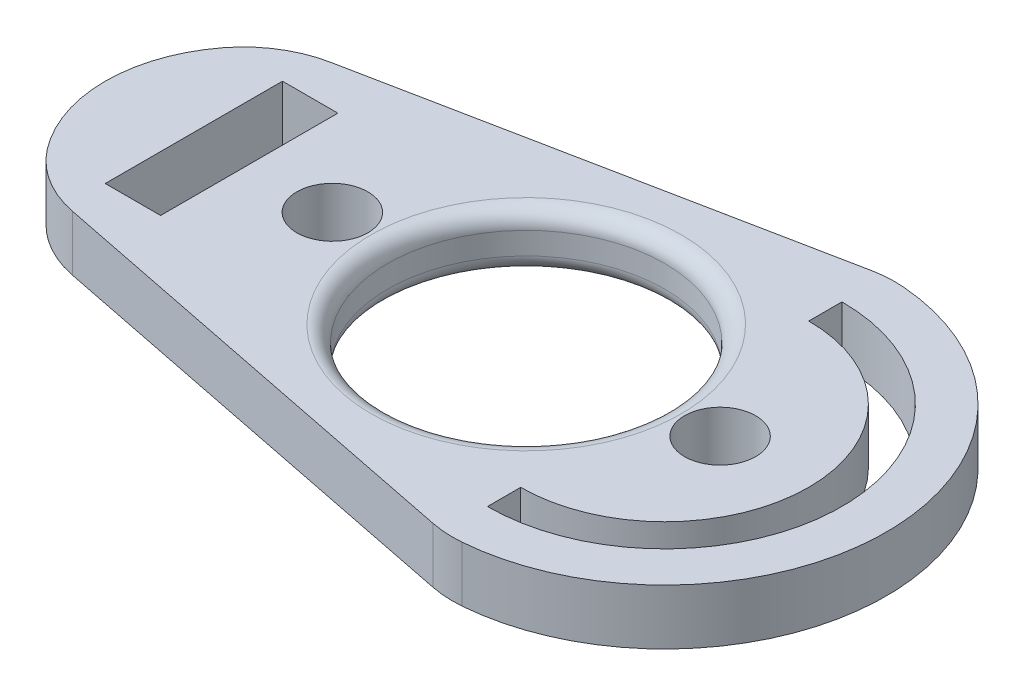
ISO-10303-21;
HEADER;
FILE_DESCRIPTION(('STEP AP214'),'2;1');
FILE_NAME('part.step','',(''),(''),'','','');
FILE_SCHEMA(('AUTOMOTIVE_DESIGN { 1 0 10303 214 1 1 1 1 }'));
ENDSEC;
DATA;
#1=APPLICATION_CONTEXT('core data for automotive mechanical design processes');
#2=APPLICATION_PROTOCOL_DEFINITION('international standard','automotive_design',2000,#1);
#3=PRODUCT_CONTEXT('',#1,'mechanical');
#4=PRODUCT('Part','Part','',(#3));
#5=PRODUCT_RELATED_PRODUCT_CATEGORY('part','',(#4));
#6=PRODUCT_DEFINITION_FORMATION('','',#4);
#7=PRODUCT_DEFINITION_CONTEXT('part definition',#1,'design');
#8=PRODUCT_DEFINITION('design','',#6,#7);
#9=PRODUCT_DEFINITION_SHAPE('','',#8);
#10=(LENGTH_UNIT() NAMED_UNIT(*) SI_UNIT(.MILLI.,.METRE.));
#11=(NAMED_UNIT(*) PLANE_ANGLE_UNIT() SI_UNIT($,.RADIAN.));
#12=(NAMED_UNIT(*) SI_UNIT($,.STERADIAN.) SOLID_ANGLE_UNIT());
#13=UNCERTAINTY_MEASURE_WITH_UNIT(LENGTH_MEASURE(1.E-05),#10,'distance_accuracy_value','');
#14=(GEOMETRIC_REPRESENTATION_CONTEXT(3) GLOBAL_UNCERTAINTY_ASSIGNED_CONTEXT((#13)) GLOBAL_UNIT_ASSIGNED_CONTEXT((#10,
#11,#12)) REPRESENTATION_CONTEXT('',''));
#15=CARTESIAN_POINT('',(0.,0.,0.));
#16=DIRECTION('',(0.,0.,1.));
#17=DIRECTION('',(1.,0.,0.));
#18=AXIS2_PLACEMENT_3D('',#15,#16,#17);
#19=CARTESIAN_POINT('',(0.,0.5,-0.8));
#20=DIRECTION('',(0.,0.,-1.));
#21=DIRECTION('',(-1.,0.,0.));
#22=AXIS2_PLACEMENT_3D('',#19,#20,#21);
#23=PLANE('',#22);
#24=DIRECTION('',(1.,0.,0.));
#25=VECTOR('',#24,1.);
#26=CARTESIAN_POINT('',(0.,0.,-0.8));
#27=LINE('',#26,#25);
#28=CARTESIAN_POINT('',(-4.25,0.,-0.8));
#29=VERTEX_POINT('',#28);
#30=CARTESIAN_POINT('',(-3.75,0.,-0.8));
#31=VERTEX_POINT('',#30);
#32=EDGE_CURVE('E223',#29,#31,#27,.T.);
#33=ORIENTED_EDGE('',*,*,#32,.T.);
#34=DIRECTION('',(0.,-1.,0.));
#35=VECTOR('',#34,1.);
#36=CARTESIAN_POINT('',(-3.75,0.5,-0.8));
#37=LINE('',#36,#35);
#38=CARTESIAN_POINT('',(-3.75,0.5,-0.8));
#39=VERTEX_POINT('',#38);
#40=EDGE_CURVE('E174',#39,#31,#37,.T.);
#41=ORIENTED_EDGE('',*,*,#40,.F.);
#42=DIRECTION('',(1.,0.,0.));
#43=VECTOR('',#42,1.);
#44=CARTESIAN_POINT('',(0.,0.5,-0.8));
#45=LINE('',#44,#43);
#46=CARTESIAN_POINT('',(-4.25,0.5,-0.8));
#47=VERTEX_POINT('',#46);
#48=EDGE_CURVE('E163',#47,#39,#45,.T.);
#49=ORIENTED_EDGE('',*,*,#48,.F.);
#50=DIRECTION('',(0.,-1.,0.));
#51=VECTOR('',#50,1.);
#52=CARTESIAN_POINT('',(-4.25,0.5,-0.8));
#53=LINE('',#52,#51);
#54=EDGE_CURVE('E54',#47,#29,#53,.T.);
#55=ORIENTED_EDGE('',*,*,#54,.T.);
#56=EDGE_LOOP('',(#33,#41,#49,#55));
#57=FACE_BOUND('',#56,.T.);
#58=ADVANCED_FACE('F37',(#57),#23,.F.);
#59=CARTESIAN_POINT('',(-3.75,0.5,0.));
#60=DIRECTION('',(1.,0.,0.));
#61=DIRECTION('',(0.,0.,-1.));
#62=AXIS2_PLACEMENT_3D('',#59,#60,#61);
#63=PLANE('',#62);
#64=DIRECTION('',(0.,0.,1.));
#65=VECTOR('',#64,1.);
#66=CARTESIAN_POINT('',(-3.75,0.,0.));
#67=LINE('',#66,#65);
#68=CARTESIAN_POINT('',(-3.75,0.,0.8));
#69=VERTEX_POINT('',#68);
#70=EDGE_CURVE('E171',#31,#69,#67,.T.);
#71=ORIENTED_EDGE('',*,*,#70,.T.);
#72=DIRECTION('',(0.,-1.,0.));
#73=VECTOR('',#72,1.);
#74=CARTESIAN_POINT('',(-3.75,0.5,0.8));
#75=LINE('',#74,#73);
#76=CARTESIAN_POINT('',(-3.75,0.5,0.8));
#77=VERTEX_POINT('',#76);
#78=EDGE_CURVE('E169',#77,#69,#75,.T.);
#79=ORIENTED_EDGE('',*,*,#78,.F.);
#80=DIRECTION('',(0.,0.,1.));
#81=VECTOR('',#80,1.);
#82=CARTESIAN_POINT('',(-3.75,0.5,0.));
#83=LINE('',#82,#81);
#84=EDGE_CURVE('E157',#39,#77,#83,.T.);
#85=ORIENTED_EDGE('',*,*,#84,.F.);
#86=ORIENTED_EDGE('',*,*,#40,.T.);
#87=EDGE_LOOP('',(#71,#79,#85,#86));
#88=FACE_BOUND('',#87,.T.);
#89=ADVANCED_FACE('F170',(#88),#63,.F.);
#90=CARTESIAN_POINT('',(0.,0.5,0.8));
#91=DIRECTION('',(0.,0.,-1.));
#92=DIRECTION('',(-1.,0.,0.));
#93=AXIS2_PLACEMENT_3D('',#90,#91,#92);
#94=PLANE('',#93);
#95=DIRECTION('',(1.,0.,0.));
#96=VECTOR('',#95,1.);
#97=CARTESIAN_POINT('',(0.,0.,0.8));
#98=LINE('',#97,#96);
#99=CARTESIAN_POINT('',(-4.25,0.,0.8));
#100=VERTEX_POINT('',#99);
#101=EDGE_CURVE('E226',#100,#69,#98,.T.);
#102=ORIENTED_EDGE('',*,*,#101,.F.);
#103=DIRECTION('',(0.,-1.,0.));
#104=VECTOR('',#103,1.);
#105=CARTESIAN_POINT('',(-4.25,0.5,0.8));
#106=LINE('',#105,#104);
#107=CARTESIAN_POINT('',(-4.25,0.5,0.8));
#108=VERTEX_POINT('',#107);
#109=EDGE_CURVE('E104',#108,#100,#106,.T.);
#110=ORIENTED_EDGE('',*,*,#109,.F.);
#111=DIRECTION('',(1.,0.,0.));
#112=VECTOR('',#111,1.);
#113=CARTESIAN_POINT('',(0.,0.5,0.8));
#114=LINE('',#113,#112);
#115=EDGE_CURVE('E162',#108,#77,#114,.T.);
#116=ORIENTED_EDGE('',*,*,#115,.T.);
#117=ORIENTED_EDGE('',*,*,#78,.T.);
#118=EDGE_LOOP('',(#102,#110,#116,#117));
#119=FACE_BOUND('',#118,.T.);
#120=ADVANCED_FACE('F176',(#119),#94,.T.);
#121=CARTESIAN_POINT('',(-1.05819487287301E-11,0.5,-1.28546370596616E-10));
#122=DIRECTION('',(0.,-1.,0.));
#123=DIRECTION('',(0.,0.,-1.));
#124=AXIS2_PLACEMENT_3D('',#121,#122,#123);
#125=CYLINDRICAL_SURFACE('',#124,1.3);
#126=CARTESIAN_POINT('',(-1.05819487287301E-11,0.,-1.28546370596616E-10));
#127=DIRECTION('',(0.,1.,0.));
#128=DIRECTION('',(0.,0.,1.));
#129=AXIS2_PLACEMENT_3D('',#126,#127,#128);
#130=CIRCLE('',#129,1.3);
#131=CARTESIAN_POINT('',(-1.0582065822565E-11,0.,-1.30000000012855));
#132=VERTEX_POINT('',#131);
#133=CARTESIAN_POINT('',(-1.0582065822565E-11,0.,1.29999999987145));
#134=VERTEX_POINT('',#133);
#135=EDGE_CURVE('E205',#132,#134,#130,.F.);
#136=ORIENTED_EDGE('',*,*,#135,.F.);
#137=DIRECTION('',(0.,-1.,0.));
#138=VECTOR('',#137,1.);
#139=CARTESIAN_POINT('',(-1.0582065822565E-11,0.5,-1.30000000012855));
#140=LINE('',#139,#138);
#141=CARTESIAN_POINT('',(-1.0582065822565E-11,0.5,-1.30000000012855));
#142=VERTEX_POINT('',#141);
#143=EDGE_CURVE('E233',#142,#132,#140,.T.);
#144=ORIENTED_EDGE('',*,*,#143,.F.);
#145=CARTESIAN_POINT('',(-1.05819487287301E-11,0.5,-1.28546370596616E-10));
#146=DIRECTION('',(0.,1.,0.));
#147=DIRECTION('',(0.,0.,1.));
#148=AXIS2_PLACEMENT_3D('',#145,#146,#147);
#149=CIRCLE('',#148,1.3);
#150=CARTESIAN_POINT('',(-1.0582065822565E-11,0.5,1.29999999987145));
#151=VERTEX_POINT('',#150);
#152=EDGE_CURVE('E399',#142,#151,#149,.F.);
#153=ORIENTED_EDGE('',*,*,#152,.T.);
#154=DIRECTION('',(0.,-1.,0.));
#155=VECTOR('',#154,1.);
#156=CARTESIAN_POINT('',(-1.0582065822565E-11,0.5,1.29999999987145));
#157=LINE('',#156,#155);
#158=EDGE_CURVE('E237',#151,#134,#157,.T.);
#159=ORIENTED_EDGE('',*,*,#158,.T.);
#160=EDGE_LOOP('',(#136,#144,#153,#159));
#161=FACE_BOUND('',#160,.T.);
#162=ADVANCED_FACE('F333',(#161),#125,.T.);
#163=CARTESIAN_POINT('',(-1.05825008262379E-11,0.5,0.));
#164=DIRECTION('',(1.,0.,0.));
#165=DIRECTION('',(0.,0.,-1.));
#166=AXIS2_PLACEMENT_3D('',#163,#164,#165);
#167=PLANE('',#166);
#168=DIRECTION('',(0.,0.,1.));
#169=VECTOR('',#168,1.);
#170=CARTESIAN_POINT('',(-1.05825008262379E-11,0.,0.));
#171=LINE('',#170,#169);
#172=CARTESIAN_POINT('',(-1.05819654371021E-11,0.,-1.60000000012855));
#173=VERTEX_POINT('',#172);
#174=EDGE_CURVE('E208',#173,#132,#171,.T.);
#175=ORIENTED_EDGE('',*,*,#174,.F.);
#176=DIRECTION('',(0.,-1.,0.));
#177=VECTOR('',#176,1.);
#178=CARTESIAN_POINT('',(-1.05819654371021E-11,0.5,-1.60000000012855));
#179=LINE('',#178,#177);
#180=CARTESIAN_POINT('',(-1.05819654371021E-11,0.5,-1.60000000012855));
#181=VERTEX_POINT('',#180);
#182=EDGE_CURVE('E242',#181,#173,#179,.T.);
#183=ORIENTED_EDGE('',*,*,#182,.F.);
#184=DIRECTION('',(0.,0.,1.));
#185=VECTOR('',#184,1.);
#186=CARTESIAN_POINT('',(-1.05825008262379E-11,0.5,0.));
#187=LINE('',#186,#185);
#188=EDGE_CURVE('E402',#181,#142,#187,.T.);
#189=ORIENTED_EDGE('',*,*,#188,.T.);
#190=ORIENTED_EDGE('',*,*,#143,.T.);
#191=EDGE_LOOP('',(#175,#183,#189,#190));
#192=FACE_BOUND('',#191,.T.);
#193=ADVANCED_FACE('F329',(#192),#167,.T.);
#194=CARTESIAN_POINT('',(-1.05819487287301E-11,0.5,-1.28546370596616E-10));
#195=DIRECTION('',(0.,-1.,0.));
#196=DIRECTION('',(0.,0.,-1.));
#197=AXIS2_PLACEMENT_3D('',#194,#195,#196);
#198=CYLINDRICAL_SURFACE('',#197,1.6);
#199=CARTESIAN_POINT('',(-1.05819487287301E-11,0.,-1.28546370596616E-10));
#200=DIRECTION('',(0.,1.,0.));
#201=DIRECTION('',(0.,0.,1.));
#202=AXIS2_PLACEMENT_3D('',#199,#200,#201);
#203=CIRCLE('',#202,1.6);
#204=CARTESIAN_POINT('',(-1.05819654371021E-11,0.,1.59999999987145));
#205=VERTEX_POINT('',#204);
#206=EDGE_CURVE('E211',#173,#205,#203,.F.);
#207=ORIENTED_EDGE('',*,*,#206,.T.);
#208=DIRECTION('',(0.,-1.,0.));
#209=VECTOR('',#208,1.);
#210=CARTESIAN_POINT('',(-1.05819654371021E-11,0.5,1.59999999987145));
#211=LINE('',#210,#209);
#212=CARTESIAN_POINT('',(-1.05819654371021E-11,0.5,1.59999999987145));
#213=VERTEX_POINT('',#212);
#214=EDGE_CURVE('E239',#213,#205,#211,.T.);
#215=ORIENTED_EDGE('',*,*,#214,.F.);
#216=CARTESIAN_POINT('',(-1.05819487287301E-11,0.5,-1.28546370596616E-10));
#217=DIRECTION('',(0.,1.,0.));
#218=DIRECTION('',(0.,0.,1.));
#219=AXIS2_PLACEMENT_3D('',#216,#217,#218);
#220=CIRCLE('',#219,1.6);
#221=EDGE_CURVE('E405',#181,#213,#220,.F.);
#222=ORIENTED_EDGE('',*,*,#221,.F.);
#223=ORIENTED_EDGE('',*,*,#182,.T.);
#224=EDGE_LOOP('',(#207,#215,#222,#223));
#225=FACE_BOUND('',#224,.T.);
#226=ADVANCED_FACE('F325',(#225),#198,.F.);
#227=CARTESIAN_POINT('',(-0.384272849561752,0.5,-1.92321957143991));
#228=DIRECTION('',(0.195934209060197,0.,0.980617043355843));
#229=DIRECTION('',(0.980617043355843,0.,-0.195934209060197));
#230=AXIS2_PLACEMENT_3D('',#227,#228,#229);
#231=PLANE('',#230);
#232=DIRECTION('',(-0.980617043355843,0.,0.195934209060197));
#233=VECTOR('',#232,1.);
#234=CARTESIAN_POINT('',(-0.384272849561752,0.,-1.92321957143991));
#235=LINE('',#234,#233);
#236=CARTESIAN_POINT('',(-0.113883759060197,0.,-1.97724522084595));
#237=VERTEX_POINT('',#236);
#238=CARTESIAN_POINT('',(-4.183235690524,0.,-1.16415997265328));
#239=VERTEX_POINT('',#238);
#240=EDGE_CURVE('E183',#237,#239,#235,.T.);
#241=ORIENTED_EDGE('',*,*,#240,.T.);
#242=DIRECTION('',(0.,-1.,0.));
#243=VECTOR('',#242,1.);
#244=CARTESIAN_POINT('',(-4.183235690524,0.5,-1.16415997265328));
#245=LINE('',#244,#243);
#246=CARTESIAN_POINT('',(-4.183235690524,0.5,-1.16415997265328));
#247=VERTEX_POINT('',#246);
#248=EDGE_CURVE('E240',#247,#239,#245,.T.);
#249=ORIENTED_EDGE('',*,*,#248,.F.);
#250=DIRECTION('',(-0.980617043355843,0.,0.195934209060197));
#251=VECTOR('',#250,1.);
#252=CARTESIAN_POINT('',(-0.384272849561752,0.5,-1.92321957143991));
#253=LINE('',#252,#251);
#254=CARTESIAN_POINT('',(-0.113883759060197,0.5,-1.97724522084595));
#255=VERTEX_POINT('',#254);
#256=EDGE_CURVE('E231',#255,#247,#253,.T.);
#257=ORIENTED_EDGE('',*,*,#256,.F.);
#258=DIRECTION('',(0.,-1.,0.));
#259=VECTOR('',#258,1.);
#260=CARTESIAN_POINT('',(-0.113883759060197,0.5,-1.97724522084595));
#261=LINE('',#260,#259);
#262=EDGE_CURVE('E179',#255,#237,#261,.T.);
#263=ORIENTED_EDGE('',*,*,#262,.T.);
#264=EDGE_LOOP('',(#241,#249,#257,#263));
#265=FACE_BOUND('',#264,.T.);
#266=ADVANCED_FACE('F328',(#265),#231,.F.);
#267=CARTESIAN_POINT('',(-3.9873014814638,0.5,-0.183542929297438));
#268=DIRECTION('',(0.,-1.,0.));
#269=DIRECTION('',(0.,0.,-1.));
#270=AXIS2_PLACEMENT_3D('',#267,#268,#269);
#271=CYLINDRICAL_SURFACE('',#270,1.);
#272=CARTESIAN_POINT('',(-3.9873014814638,0.,-0.183542929297438));
#273=DIRECTION('',(0.,1.,0.));
#274=DIRECTION('',(0.,0.,1.));
#275=AXIS2_PLACEMENT_3D('',#272,#273,#274);
#276=CIRCLE('',#275,1.);
#277=CARTESIAN_POINT('',(-4.77830641967648,0.,-0.795352693622231));
#278=VERTEX_POINT('',#277);
#279=EDGE_CURVE('E186',#239,#278,#276,.T.);
#280=ORIENTED_EDGE('',*,*,#279,.T.);
#281=DIRECTION('',(0.,-1.,0.));
#282=VECTOR('',#281,1.);
#283=CARTESIAN_POINT('',(-4.77830641967648,0.5,-0.795352693622231));
#284=LINE('',#283,#282);
#285=CARTESIAN_POINT('',(-4.77830641967648,0.5,-0.795352693622231));
#286=VERTEX_POINT('',#285);
#287=EDGE_CURVE('E257',#286,#278,#284,.T.);
#288=ORIENTED_EDGE('',*,*,#287,.F.);
#289=CARTESIAN_POINT('',(-3.9873014814638,0.5,-0.183542929297438));
#290=DIRECTION('',(0.,1.,0.));
#291=DIRECTION('',(0.,0.,1.));
#292=AXIS2_PLACEMENT_3D('',#289,#290,#291);
#293=CIRCLE('',#292,1.);
#294=EDGE_CURVE('E117',#247,#286,#293,.T.);
#295=ORIENTED_EDGE('',*,*,#294,.F.);
#296=ORIENTED_EDGE('',*,*,#248,.T.);
#297=EDGE_LOOP('',(#280,#288,#295,#296));
#298=FACE_BOUND('',#297,.T.);
#299=ADVANCED_FACE('F356',(#298),#271,.T.);
#300=CARTESIAN_POINT('',(-3.75,0.5,0.));
#301=DIRECTION('',(0.,-1.,0.));
#302=DIRECTION('',(0.,0.,-1.));
#303=AXIS2_PLACEMENT_3D('',#300,#301,#302);
#304=CYLINDRICAL_SURFACE('',#303,1.3);
#305=CARTESIAN_POINT('',(-3.75,0.,0.));
#306=DIRECTION('',(0.,1.,0.));
#307=DIRECTION('',(0.,0.,1.));
#308=AXIS2_PLACEMENT_3D('',#305,#306,#307);
#309=CIRCLE('',#308,1.3);
#310=CARTESIAN_POINT('',(-4.77830641967648,0.,0.795352693622231));
#311=VERTEX_POINT('',#310);
#312=EDGE_CURVE('E188',#278,#311,#309,.T.);
#313=ORIENTED_EDGE('',*,*,#312,.T.);
#314=DIRECTION('',(0.,-1.,0.));
#315=VECTOR('',#314,1.);
#316=CARTESIAN_POINT('',(-4.77830641967648,0.5,0.795352693622231));
#317=LINE('',#316,#315);
#318=CARTESIAN_POINT('',(-4.77830641967648,0.5,0.795352693622231));
#319=VERTEX_POINT('',#318);
#320=EDGE_CURVE('E255',#319,#311,#317,.T.);
#321=ORIENTED_EDGE('',*,*,#320,.F.);
#322=CARTESIAN_POINT('',(-3.75,0.5,0.));
#323=DIRECTION('',(0.,1.,0.));
#324=DIRECTION('',(0.,0.,1.));
#325=AXIS2_PLACEMENT_3D('',#322,#323,#324);
#326=CIRCLE('',#325,1.3);
#327=EDGE_CURVE('E386',#286,#319,#326,.T.);
#328=ORIENTED_EDGE('',*,*,#327,.F.);
#329=ORIENTED_EDGE('',*,*,#287,.T.);
#330=EDGE_LOOP('',(#313,#321,#328,#329));
#331=FACE_BOUND('',#330,.T.);
#332=ADVANCED_FACE('F352',(#331),#304,.T.);
#333=CARTESIAN_POINT('',(-3.9873014814638,0.5,0.183542929297438));
#334=DIRECTION('',(0.,-1.,0.));
#335=DIRECTION('',(0.,0.,-1.));
#336=AXIS2_PLACEMENT_3D('',#333,#334,#335);
#337=CYLINDRICAL_SURFACE('',#336,1.);
#338=CARTESIAN_POINT('',(-3.9873014814638,0.,0.183542929297438));
#339=DIRECTION('',(0.,1.,0.));
#340=DIRECTION('',(0.,0.,1.));
#341=AXIS2_PLACEMENT_3D('',#338,#339,#340);
#342=CIRCLE('',#341,1.);
#343=CARTESIAN_POINT('',(-4.183235690524,0.,1.16415997265328));
#344=VERTEX_POINT('',#343);
#345=EDGE_CURVE('E191',#344,#311,#342,.F.);
#346=ORIENTED_EDGE('',*,*,#345,.F.);
#347=DIRECTION('',(0.,-1.,0.));
#348=VECTOR('',#347,1.);
#349=CARTESIAN_POINT('',(-4.183235690524,0.5,1.16415997265328));
#350=LINE('',#349,#348);
#351=CARTESIAN_POINT('',(-4.183235690524,0.5,1.16415997265328));
#352=VERTEX_POINT('',#351);
#353=EDGE_CURVE('E253',#352,#344,#350,.T.);
#354=ORIENTED_EDGE('',*,*,#353,.F.);
#355=CARTESIAN_POINT('',(-3.9873014814638,0.5,0.183542929297438));
#356=DIRECTION('',(0.,1.,0.));
#357=DIRECTION('',(0.,0.,1.));
#358=AXIS2_PLACEMENT_3D('',#355,#356,#357);
#359=CIRCLE('',#358,1.);
#360=EDGE_CURVE('E388',#352,#319,#359,.F.);
#361=ORIENTED_EDGE('',*,*,#360,.T.);
#362=ORIENTED_EDGE('',*,*,#320,.T.);
#363=EDGE_LOOP('',(#346,#354,#361,#362));
#364=FACE_BOUND('',#363,.T.);
#365=ADVANCED_FACE('F348',(#364),#337,.T.);
#366=CARTESIAN_POINT('',(-0.384272849561752,0.5,1.92321957143991));
#367=DIRECTION('',(-0.195934209060197,0.,0.980617043355843));
#368=DIRECTION('',(0.980617043355843,0.,0.195934209060197));
#369=AXIS2_PLACEMENT_3D('',#366,#367,#368);
#370=PLANE('',#369);
#371=DIRECTION('',(-0.980617043355843,0.,-0.195934209060197));
#372=VECTOR('',#371,1.);
#373=CARTESIAN_POINT('',(-0.384272849561752,0.,1.92321957143991));
#374=LINE('',#373,#372);
#375=CARTESIAN_POINT('',(-0.113883759971435,0.,1.97724522066388));
#376=VERTEX_POINT('',#375);
#377=EDGE_CURVE('E194',#376,#344,#374,.T.);
#378=ORIENTED_EDGE('',*,*,#377,.F.);
#379=DIRECTION('',(0.,-1.,0.));
#380=VECTOR('',#379,1.);
#381=CARTESIAN_POINT('',(-0.113883759971435,0.5,1.97724522066388));
#382=LINE('',#381,#380);
#383=CARTESIAN_POINT('',(-0.113883759971435,0.5,1.97724522066388));
#384=VERTEX_POINT('',#383);
#385=EDGE_CURVE('E251',#384,#376,#382,.T.);
#386=ORIENTED_EDGE('',*,*,#385,.F.);
#387=DIRECTION('',(-0.980617043355843,0.,-0.195934209060197));
#388=VECTOR('',#387,1.);
#389=CARTESIAN_POINT('',(-0.384272849561752,0.5,1.92321957143991));
#390=LINE('',#389,#388);
#391=EDGE_CURVE('E380',#384,#352,#390,.T.);
#392=ORIENTED_EDGE('',*,*,#391,.T.);
#393=ORIENTED_EDGE('',*,*,#353,.T.);
#394=EDGE_LOOP('',(#378,#386,#392,#393));
#395=FACE_BOUND('',#394,.T.);
#396=ADVANCED_FACE('F344',(#395),#370,.T.);
#397=CARTESIAN_POINT('',(0.0820504490887623,0.5,0.996628177308034));
#398=DIRECTION('',(0.,-1.,0.));
#399=DIRECTION('',(0.,0.,-1.));
#400=AXIS2_PLACEMENT_3D('',#397,#398,#399);
#401=CYLINDRICAL_SURFACE('',#400,1.);
#402=CARTESIAN_POINT('',(0.0820504490887623,0.,0.996628177308034));
#403=DIRECTION('',(0.,1.,0.));
#404=DIRECTION('',(0.,0.,1.));
#405=AXIS2_PLACEMENT_3D('',#402,#403,#404);
#406=CIRCLE('',#405,1.);
#407=CARTESIAN_POINT('',(0.164100898177525,0.,1.99325635461607));
#408=VERTEX_POINT('',#407);
#409=EDGE_CURVE('E197',#376,#408,#406,.T.);
#410=ORIENTED_EDGE('',*,*,#409,.T.);
#411=DIRECTION('',(0.,-1.,0.));
#412=VECTOR('',#411,1.);
#413=CARTESIAN_POINT('',(0.164100898177525,0.5,1.99325635461607));
#414=LINE('',#413,#412);
#415=CARTESIAN_POINT('',(0.164100898177525,0.5,1.99325635461607));
#416=VERTEX_POINT('',#415);
#417=EDGE_CURVE('E249',#416,#408,#414,.T.);
#418=ORIENTED_EDGE('',*,*,#417,.F.);
#419=CARTESIAN_POINT('',(0.0820504490887623,0.5,0.996628177308034));
#420=DIRECTION('',(0.,1.,0.));
#421=DIRECTION('',(0.,0.,1.));
#422=AXIS2_PLACEMENT_3D('',#419,#420,#421);
#423=CIRCLE('',#422,1.);
#424=EDGE_CURVE('E395',#384,#416,#423,.T.);
#425=ORIENTED_EDGE('',*,*,#424,.F.);
#426=ORIENTED_EDGE('',*,*,#385,.T.);
#427=EDGE_LOOP('',(#410,#418,#425,#426));
#428=FACE_BOUND('',#427,.T.);
#429=ADVANCED_FACE('F340',(#428),#401,.T.);
#430=CARTESIAN_POINT('',(-1.05819487287301E-11,0.5,-1.28546370596616E-10));
#431=DIRECTION('',(0.,-1.,0.));
#432=DIRECTION('',(0.,0.,-1.));
#433=AXIS2_PLACEMENT_3D('',#430,#431,#432);
#434=CYLINDRICAL_SURFACE('',#433,2.00000000012898);
#435=CARTESIAN_POINT('',(-1.05819487287301E-11,0.,-1.28546370596616E-10));
#436=DIRECTION('',(0.,1.,0.));
#437=DIRECTION('',(0.,0.,1.));
#438=AXIS2_PLACEMENT_3D('',#435,#436,#437);
#439=CIRCLE('',#438,2.00000000012898);
#440=CARTESIAN_POINT('',(0.164100899999999,0.,-1.99325635472312));
#441=VERTEX_POINT('',#440);
#442=EDGE_CURVE('E200',#441,#408,#439,.F.);
#443=ORIENTED_EDGE('',*,*,#442,.F.);
#444=DIRECTION('',(0.,-1.,0.));
#445=VECTOR('',#444,1.);
#446=CARTESIAN_POINT('',(0.164100899999999,0.5,-1.99325635472312));
#447=LINE('',#446,#445);
#448=CARTESIAN_POINT('',(0.164100899999999,0.5,-1.99325635472312));
#449=VERTEX_POINT('',#448);
#450=EDGE_CURVE('E247',#449,#441,#447,.T.);
#451=ORIENTED_EDGE('',*,*,#450,.F.);
#452=CARTESIAN_POINT('',(-1.05819487287301E-11,0.5,-1.28546370596616E-10));
#453=DIRECTION('',(0.,1.,0.));
#454=DIRECTION('',(0.,0.,1.));
#455=AXIS2_PLACEMENT_3D('',#452,#453,#454);
#456=CIRCLE('',#455,2.00000000012898);
#457=EDGE_CURVE('E374',#449,#416,#456,.F.);
#458=ORIENTED_EDGE('',*,*,#457,.T.);
#459=ORIENTED_EDGE('',*,*,#417,.T.);
#460=EDGE_LOOP('',(#443,#451,#458,#459));
#461=FACE_BOUND('',#460,.T.);
#462=ADVANCED_FACE('F314',(#461),#434,.T.);
#463=CARTESIAN_POINT('',(-3.,0.5,0.));
#464=DIRECTION('',(0.,-1.,0.));
#465=DIRECTION('',(0.,0.,-1.));
#466=AXIS2_PLACEMENT_3D('',#463,#464,#465);
#467=CYLINDRICAL_SURFACE('',#466,0.3207);
#468=CARTESIAN_POINT('',(-3.,0.5,0.));
#469=DIRECTION('',(0.,1.,0.));
#470=DIRECTION('',(0.,0.,1.));
#471=AXIS2_PLACEMENT_3D('',#468,#469,#470);
#472=CIRCLE('',#471,0.3207);
#473=CARTESIAN_POINT('',(-3.,0.5,0.3207));
#474=VERTEX_POINT('',#473);
#475=EDGE_CURVE('E413',#474,#474,#472,.T.);
#476=ORIENTED_EDGE('',*,*,#475,.T.);
#477=EDGE_LOOP('',(#476));
#478=FACE_BOUND('',#477,.T.);
#479=CARTESIAN_POINT('',(-3.,0.,0.));
#480=DIRECTION('',(0.,1.,0.));
#481=DIRECTION('',(0.,0.,1.));
#482=AXIS2_PLACEMENT_3D('',#479,#480,#481);
#483=CIRCLE('',#482,0.3207);
#484=CARTESIAN_POINT('',(-3.,0.,0.3207));
#485=VERTEX_POINT('',#484);
#486=EDGE_CURVE('E220',#485,#485,#483,.T.);
#487=ORIENTED_EDGE('',*,*,#486,.F.);
#488=EDGE_LOOP('',(#487));
#489=FACE_BOUND('',#488,.T.);
#490=ADVANCED_FACE('F311',(#478,#489),#467,.F.);
#491=CARTESIAN_POINT('',(-1.24999999999968,0.5,0.));
#492=DIRECTION('',(0.,-1.,0.));
#493=DIRECTION('',(0.,0.,-1.));
#494=AXIS2_PLACEMENT_3D('',#491,#492,#493);
#495=CYLINDRICAL_SURFACE('',#494,1.24999999999969);
#496=CARTESIAN_POINT('',(-1.24999999999968,0.15,0.));
#497=DIRECTION('',(0.,1.,0.));
#498=DIRECTION('',(0.,0.,1.));
#499=AXIS2_PLACEMENT_3D('',#496,#497,#498);
#500=CIRCLE('',#499,1.24999999999969);
#501=CARTESIAN_POINT('',(-1.24999999999968,0.15,1.24999999999969));
#502=VERTEX_POINT('',#501);
#503=EDGE_CURVE('E46',#502,#502,#500,.F.);
#504=ORIENTED_EDGE('',*,*,#503,.T.);
#505=EDGE_LOOP('',(#504));
#506=FACE_BOUND('',#505,.T.);
#507=CARTESIAN_POINT('',(-1.24999999999968,0.35,0.));
#508=DIRECTION('',(0.,1.,0.));
#509=DIRECTION('',(0.,0.,1.));
#510=AXIS2_PLACEMENT_3D('',#507,#508,#509);
#511=CIRCLE('',#510,1.24999999999969);
#512=CARTESIAN_POINT('',(-1.24999999999968,0.35,1.24999999999969));
#513=VERTEX_POINT('',#512);
#514=EDGE_CURVE('E263',#513,#513,#511,.T.);
#515=ORIENTED_EDGE('',*,*,#514,.T.);
#516=EDGE_LOOP('',(#515));
#517=FACE_BOUND('',#516,.T.);
#518=ADVANCED_FACE('F268',(#506,#517),#495,.F.);
#519=CARTESIAN_POINT('',(0.5,0.5,0.));
#520=DIRECTION('',(0.,-1.,0.));
#521=DIRECTION('',(0.,0.,-1.));
#522=AXIS2_PLACEMENT_3D('',#519,#520,#521);
#523=CYLINDRICAL_SURFACE('',#522,0.3207);
#524=CARTESIAN_POINT('',(0.5,0.5,0.));
#525=DIRECTION('',(0.,1.,0.));
#526=DIRECTION('',(0.,0.,1.));
#527=AXIS2_PLACEMENT_3D('',#524,#525,#526);
#528=CIRCLE('',#527,0.3207);
#529=CARTESIAN_POINT('',(0.5,0.5,0.3207));
#530=VERTEX_POINT('',#529);
#531=EDGE_CURVE('E410',#530,#530,#528,.T.);
#532=ORIENTED_EDGE('',*,*,#531,.T.);
#533=EDGE_LOOP('',(#532));
#534=FACE_BOUND('',#533,.T.);
#535=CARTESIAN_POINT('',(0.5,0.,0.));
#536=DIRECTION('',(0.,1.,0.));
#537=DIRECTION('',(0.,0.,1.));
#538=AXIS2_PLACEMENT_3D('',#535,#536,#537);
#539=CIRCLE('',#538,0.3207);
#540=CARTESIAN_POINT('',(0.5,0.,0.3207));
#541=VERTEX_POINT('',#540);
#542=EDGE_CURVE('E217',#541,#541,#539,.T.);
#543=ORIENTED_EDGE('',*,*,#542,.F.);
#544=EDGE_LOOP('',(#543));
#545=FACE_BOUND('',#544,.T.);
#546=ADVANCED_FACE('F318',(#534,#545),#523,.F.);
#547=CARTESIAN_POINT('',(-1.05825008262378E-11,0.5,0.));
#548=DIRECTION('',(1.,0.,0.));
#549=DIRECTION('',(0.,0.,-1.));
#550=AXIS2_PLACEMENT_3D('',#547,#548,#549);
#551=PLANE('',#550);
#552=DIRECTION('',(0.,0.,1.));
#553=VECTOR('',#552,1.);
#554=CARTESIAN_POINT('',(-1.05825008262378E-11,0.,0.));
#555=LINE('',#554,#553);
#556=EDGE_CURVE('E214',#134,#205,#555,.T.);
#557=ORIENTED_EDGE('',*,*,#556,.F.);
#558=ORIENTED_EDGE('',*,*,#158,.F.);
#559=DIRECTION('',(0.,0.,1.));
#560=VECTOR('',#559,1.);
#561=CARTESIAN_POINT('',(-1.05825008262378E-11,0.5,0.));
#562=LINE('',#561,#560);
#563=EDGE_CURVE('E407',#151,#213,#562,.T.);
#564=ORIENTED_EDGE('',*,*,#563,.T.);
#565=ORIENTED_EDGE('',*,*,#214,.T.);
#566=EDGE_LOOP('',(#557,#558,#564,#565));
#567=FACE_BOUND('',#566,.T.);
#568=ADVANCED_FACE('F300',(#567),#551,.T.);
#569=CARTESIAN_POINT('',(0.0820504499999999,0.5,-0.996628177490106));
#570=DIRECTION('',(0.,-1.,0.));
#571=DIRECTION('',(0.,0.,-1.));
#572=AXIS2_PLACEMENT_3D('',#569,#570,#571);
#573=CYLINDRICAL_SURFACE('',#572,1.);
#574=CARTESIAN_POINT('',(0.0820504499999999,0.,-0.996628177490106));
#575=DIRECTION('',(0.,1.,0.));
#576=DIRECTION('',(0.,0.,1.));
#577=AXIS2_PLACEMENT_3D('',#574,#575,#576);
#578=CIRCLE('',#577,1.);
#579=EDGE_CURVE('E203',#441,#237,#578,.T.);
#580=ORIENTED_EDGE('',*,*,#579,.T.);
#581=ORIENTED_EDGE('',*,*,#262,.F.);
#582=CARTESIAN_POINT('',(0.0820504499999999,0.5,-0.996628177490106));
#583=DIRECTION('',(0.,1.,0.));
#584=DIRECTION('',(0.,0.,1.));
#585=AXIS2_PLACEMENT_3D('',#582,#583,#584);
#586=CIRCLE('',#585,1.);
#587=EDGE_CURVE('E368',#449,#255,#586,.T.);
#588=ORIENTED_EDGE('',*,*,#587,.F.);
#589=ORIENTED_EDGE('',*,*,#450,.T.);
#590=EDGE_LOOP('',(#580,#581,#588,#589));
#591=FACE_BOUND('',#590,.T.);
#592=ADVANCED_FACE('F292',(#591),#573,.T.);
#593=CARTESIAN_POINT('',(-4.25,0.5,0.));
#594=DIRECTION('',(1.,0.,0.));
#595=DIRECTION('',(0.,0.,-1.));
#596=AXIS2_PLACEMENT_3D('',#593,#594,#595);
#597=PLANE('',#596);
#598=DIRECTION('',(0.,0.,1.));
#599=VECTOR('',#598,1.);
#600=CARTESIAN_POINT('',(-4.25,0.,0.));
#601=LINE('',#600,#599);
#602=EDGE_CURVE('E228',#29,#100,#601,.T.);
#603=ORIENTED_EDGE('',*,*,#602,.F.);
#604=ORIENTED_EDGE('',*,*,#54,.F.);
#605=DIRECTION('',(0.,0.,1.));
#606=VECTOR('',#605,1.);
#607=CARTESIAN_POINT('',(-4.25,0.5,0.));
#608=LINE('',#607,#606);
#609=EDGE_CURVE('E177',#47,#108,#608,.T.);
#610=ORIENTED_EDGE('',*,*,#609,.T.);
#611=ORIENTED_EDGE('',*,*,#109,.T.);
#612=EDGE_LOOP('',(#603,#604,#610,#611));
#613=FACE_BOUND('',#612,.T.);
#614=ADVANCED_FACE('F290',(#613),#597,.T.);
#615=CARTESIAN_POINT('',(0.,0.5,0.));
#616=DIRECTION('',(0.,1.,0.));
#617=DIRECTION('',(0.,0.,1.));
#618=AXIS2_PLACEMENT_3D('',#615,#616,#617);
#619=PLANE('',#618);
#620=CARTESIAN_POINT('',(-1.24999999999968,0.5,0.));
#621=DIRECTION('',(0.,1.,0.));
#622=DIRECTION('',(0.,0.,1.));
#623=AXIS2_PLACEMENT_3D('',#620,#621,#622);
#624=CIRCLE('',#623,1.39999999999969);
#625=CARTESIAN_POINT('',(-1.24999999999968,0.5,1.39999999999969));
#626=VERTEX_POINT('',#625);
#627=EDGE_CURVE('E11',#626,#626,#624,.F.);
#628=ORIENTED_EDGE('',*,*,#627,.T.);
#629=EDGE_LOOP('',(#628));
#630=FACE_BOUND('',#629,.T.);
#631=ORIENTED_EDGE('',*,*,#256,.T.);
#632=ORIENTED_EDGE('',*,*,#294,.T.);
#633=ORIENTED_EDGE('',*,*,#327,.T.);
#634=ORIENTED_EDGE('',*,*,#360,.F.);
#635=ORIENTED_EDGE('',*,*,#391,.F.);
#636=ORIENTED_EDGE('',*,*,#424,.T.);
#637=ORIENTED_EDGE('',*,*,#457,.F.);
#638=ORIENTED_EDGE('',*,*,#587,.T.);
#639=EDGE_LOOP('',(#631,#632,#633,#634,#635,#636,#637,#638));
#640=FACE_BOUND('',#639,.T.);
#641=ORIENTED_EDGE('',*,*,#152,.F.);
#642=ORIENTED_EDGE('',*,*,#188,.F.);
#643=ORIENTED_EDGE('',*,*,#221,.T.);
#644=ORIENTED_EDGE('',*,*,#563,.F.);
#645=EDGE_LOOP('',(#641,#642,#643,#644));
#646=FACE_BOUND('',#645,.T.);
#647=ORIENTED_EDGE('',*,*,#531,.F.);
#648=EDGE_LOOP('',(#647));
#649=FACE_BOUND('',#648,.T.);
#650=ORIENTED_EDGE('',*,*,#475,.F.);
#651=EDGE_LOOP('',(#650));
#652=FACE_BOUND('',#651,.T.);
#653=ORIENTED_EDGE('',*,*,#48,.T.);
#654=ORIENTED_EDGE('',*,*,#84,.T.);
#655=ORIENTED_EDGE('',*,*,#115,.F.);
#656=ORIENTED_EDGE('',*,*,#609,.F.);
#657=EDGE_LOOP('',(#653,#654,#655,#656));
#658=FACE_BOUND('',#657,.T.);
#659=ADVANCED_FACE('F159',(#630,#640,#646,#649,#652,#658),#619,.T.);
#660=CARTESIAN_POINT('',(0.,0.,0.));
#661=DIRECTION('',(0.,1.,0.));
#662=DIRECTION('',(0.,0.,1.));
#663=AXIS2_PLACEMENT_3D('',#660,#661,#662);
#664=PLANE('',#663);
#665=CARTESIAN_POINT('',(-1.24999999999968,0.,0.));
#666=DIRECTION('',(0.,1.,0.));
#667=DIRECTION('',(0.,0.,1.));
#668=AXIS2_PLACEMENT_3D('',#665,#666,#667);
#669=CIRCLE('',#668,1.39999999999969);
#670=CARTESIAN_POINT('',(-1.24999999999968,0.,1.39999999999969));
#671=VERTEX_POINT('',#670);
#672=EDGE_CURVE('E236',#671,#671,#669,.T.);
#673=ORIENTED_EDGE('',*,*,#672,.T.);
#674=EDGE_LOOP('',(#673));
#675=FACE_BOUND('',#674,.T.);
#676=ORIENTED_EDGE('',*,*,#240,.F.);
#677=ORIENTED_EDGE('',*,*,#579,.F.);
#678=ORIENTED_EDGE('',*,*,#442,.T.);
#679=ORIENTED_EDGE('',*,*,#409,.F.);
#680=ORIENTED_EDGE('',*,*,#377,.T.);
#681=ORIENTED_EDGE('',*,*,#345,.T.);
#682=ORIENTED_EDGE('',*,*,#312,.F.);
#683=ORIENTED_EDGE('',*,*,#279,.F.);
#684=EDGE_LOOP('',(#676,#677,#678,#679,#680,#681,#682,#683));
#685=FACE_BOUND('',#684,.T.);
#686=ORIENTED_EDGE('',*,*,#135,.T.);
#687=ORIENTED_EDGE('',*,*,#556,.T.);
#688=ORIENTED_EDGE('',*,*,#206,.F.);
#689=ORIENTED_EDGE('',*,*,#174,.T.);
#690=EDGE_LOOP('',(#686,#687,#688,#689));
#691=FACE_BOUND('',#690,.T.);
#692=ORIENTED_EDGE('',*,*,#542,.T.);
#693=EDGE_LOOP('',(#692));
#694=FACE_BOUND('',#693,.T.);
#695=ORIENTED_EDGE('',*,*,#486,.T.);
#696=EDGE_LOOP('',(#695));
#697=FACE_BOUND('',#696,.T.);
#698=ORIENTED_EDGE('',*,*,#32,.F.);
#699=ORIENTED_EDGE('',*,*,#602,.T.);
#700=ORIENTED_EDGE('',*,*,#101,.T.);
#701=ORIENTED_EDGE('',*,*,#70,.F.);
#702=EDGE_LOOP('',(#698,#699,#700,#701));
#703=FACE_BOUND('',#702,.T.);
#704=ADVANCED_FACE('F274',(#675,#685,#691,#694,#697,#703),#664,.F.);
#705=CARTESIAN_POINT('',(-1.24999999999968,0.15,0.));
#706=DIRECTION('',(0.,1.,0.));
#707=DIRECTION('',(0.,0.,1.));
#708=AXIS2_PLACEMENT_3D('',#705,#706,#707);
#709=TOROIDAL_SURFACE('',#708,1.39999999999969,0.15);
#710=ORIENTED_EDGE('',*,*,#503,.F.);
#711=EDGE_LOOP('',(#710));
#712=FACE_BOUND('',#711,.T.);
#713=ORIENTED_EDGE('',*,*,#672,.F.);
#714=EDGE_LOOP('',(#713));
#715=FACE_BOUND('',#714,.T.);
#716=ADVANCED_FACE('F271',(#712,#715),#709,.T.);
#717=CARTESIAN_POINT('',(-1.24999999999968,0.35,0.));
#718=DIRECTION('',(0.,1.,0.));
#719=DIRECTION('',(0.,0.,1.));
#720=AXIS2_PLACEMENT_3D('',#717,#718,#719);
#721=TOROIDAL_SURFACE('',#720,1.39999999999969,0.15);
#722=ORIENTED_EDGE('',*,*,#627,.F.);
#723=EDGE_LOOP('',(#722));
#724=FACE_BOUND('',#723,.T.);
#725=ORIENTED_EDGE('',*,*,#514,.F.);
#726=EDGE_LOOP('',(#725));
#727=FACE_BOUND('',#726,.T.);
#728=ADVANCED_FACE('F39',(#724,#727),#721,.T.);
#729=CLOSED_SHELL('',(#58,#89,#120,#162,#193,#226,#266,#299,#332,#365,#396,#429,#462,#490,#518,
#546,#568,#592,#614,#659,#704,#716,#728));
#730=MANIFOLD_SOLID_BREP('B2',#729);
#731=ADVANCED_BREP_SHAPE_REPRESENTATION('',(#18,#730),#14);
#732=SHAPE_DEFINITION_REPRESENTATION(#9,#731);
ENDSEC;
END-ISO-10303-21;
